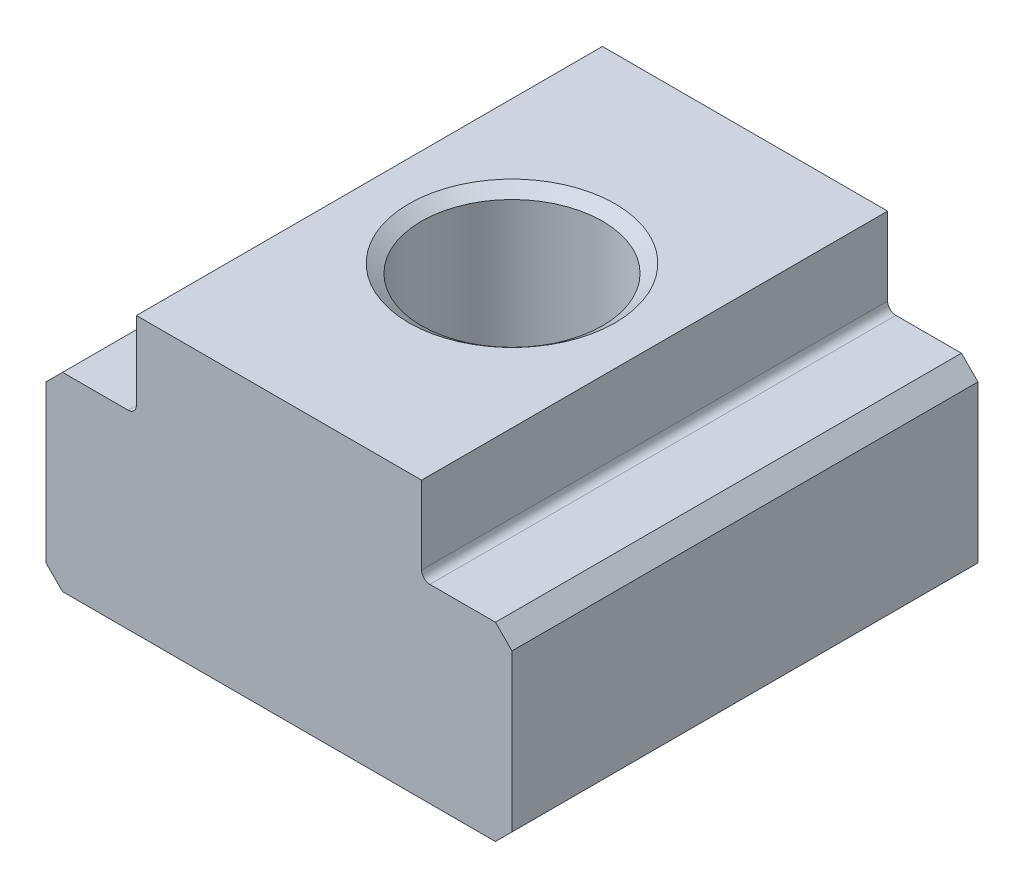
ISO-10303-21;
HEADER;
FILE_DESCRIPTION(('STEP AP214'),'2;1');
FILE_NAME('part.step','',(''),(''),'','','');
FILE_SCHEMA(('AUTOMOTIVE_DESIGN { 1 0 10303 214 1 1 1 1 }'));
ENDSEC;
DATA;
#1=APPLICATION_CONTEXT('core data for automotive mechanical design processes');
#2=APPLICATION_PROTOCOL_DEFINITION('international standard','automotive_design',2000,#1);
#3=PRODUCT_CONTEXT('',#1,'mechanical');
#4=PRODUCT('Part','Part','',(#3));
#5=PRODUCT_RELATED_PRODUCT_CATEGORY('part','',(#4));
#6=PRODUCT_DEFINITION_FORMATION('','',#4);
#7=PRODUCT_DEFINITION_CONTEXT('part definition',#1,'design');
#8=PRODUCT_DEFINITION('design','',#6,#7);
#9=PRODUCT_DEFINITION_SHAPE('','',#8);
#10=(LENGTH_UNIT() NAMED_UNIT(*) SI_UNIT(.MILLI.,.METRE.));
#11=(NAMED_UNIT(*) PLANE_ANGLE_UNIT() SI_UNIT($,.RADIAN.));
#12=(NAMED_UNIT(*) SI_UNIT($,.STERADIAN.) SOLID_ANGLE_UNIT());
#13=UNCERTAINTY_MEASURE_WITH_UNIT(LENGTH_MEASURE(1.E-05),#10,'distance_accuracy_value','');
#14=(GEOMETRIC_REPRESENTATION_CONTEXT(3) GLOBAL_UNCERTAINTY_ASSIGNED_CONTEXT((#13)) GLOBAL_UNIT_ASSIGNED_CONTEXT((#10,
#11,#12)) REPRESENTATION_CONTEXT('',''));
#15=CARTESIAN_POINT('',(0.,0.,0.));
#16=DIRECTION('',(0.,0.,1.));
#17=DIRECTION('',(1.,0.,0.));
#18=AXIS2_PLACEMENT_3D('',#15,#16,#17);
#19=CARTESIAN_POINT('',(0.,0.,-21.4376));
#20=DIRECTION('',(0.,1.,0.));
#21=DIRECTION('',(-1.,0.,0.));
#22=AXIS2_PLACEMENT_3D('',#19,#20,#21);
#23=CYLINDRICAL_SURFACE('',#22,8.33374);
#24=CARTESIAN_POINT('',(0.,0.859529231967694,-21.4376));
#25=DIRECTION('',(0.,-1.,0.));
#26=DIRECTION('',(0.,0.,-1.));
#27=AXIS2_PLACEMENT_3D('',#24,#25,#26);
#28=CIRCLE('',#27,8.33374);
#29=CARTESIAN_POINT('',(0.,0.859529231967695,-29.77134));
#30=VERTEX_POINT('',#29);
#31=EDGE_CURVE('E245',#30,#30,#28,.F.);
#32=ORIENTED_EDGE('',*,*,#31,.F.);
#33=EDGE_LOOP('',(#32));
#34=FACE_BOUND('',#33,.T.);
#35=CARTESIAN_POINT('',(0.,24.5912707680323,-21.4376));
#36=DIRECTION('',(0.,1.,0.));
#37=DIRECTION('',(0.,0.,1.));
#38=AXIS2_PLACEMENT_3D('',#35,#36,#37);
#39=CIRCLE('',#38,8.33374);
#40=CARTESIAN_POINT('',(0.,24.5912707680323,-13.10386));
#41=VERTEX_POINT('',#40);
#42=EDGE_CURVE('E262',#41,#41,#39,.F.);
#43=ORIENTED_EDGE('',*,*,#42,.F.);
#44=EDGE_LOOP('',(#43));
#45=FACE_BOUND('',#44,.T.);
#46=ADVANCED_FACE('F32',(#34,#45),#23,.F.);
#47=CARTESIAN_POINT('',(-21.4376,0.,-42.8752));
#48=DIRECTION('',(-1.,0.,0.));
#49=DIRECTION('',(0.,-1.,0.));
#50=AXIS2_PLACEMENT_3D('',#47,#48,#49);
#51=PLANE('',#50);
#52=DIRECTION('',(0.,-1.,0.));
#53=VECTOR('',#52,1.);
#54=CARTESIAN_POINT('',(-21.4376,0.,-42.8752));
#55=LINE('',#54,#53);
#56=CARTESIAN_POINT('',(-21.4376,15.9512,-42.8752));
#57=VERTEX_POINT('',#56);
#58=CARTESIAN_POINT('',(-21.4376,1.52400000000001,-42.8752));
#59=VERTEX_POINT('',#58);
#60=EDGE_CURVE('E206',#57,#59,#55,.T.);
#61=ORIENTED_EDGE('',*,*,#60,.T.);
#62=DIRECTION('',(0.,0.,1.));
#63=VECTOR('',#62,1.);
#64=CARTESIAN_POINT('',(-21.4376,1.52400000000001,-42.8752));
#65=LINE('',#64,#63);
#66=CARTESIAN_POINT('',(-21.4376,1.52400000000001,0.));
#67=VERTEX_POINT('',#66);
#68=EDGE_CURVE('E41',#59,#67,#65,.T.);
#69=ORIENTED_EDGE('',*,*,#68,.T.);
#70=DIRECTION('',(0.,-1.,0.));
#71=VECTOR('',#70,1.);
#72=CARTESIAN_POINT('',(-21.4376,0.,0.));
#73=LINE('',#72,#71);
#74=CARTESIAN_POINT('',(-21.4376,15.9512,0.));
#75=VERTEX_POINT('',#74);
#76=EDGE_CURVE('E178',#75,#67,#73,.T.);
#77=ORIENTED_EDGE('',*,*,#76,.F.);
#78=DIRECTION('',(0.,0.,-1.));
#79=VECTOR('',#78,1.);
#80=CARTESIAN_POINT('',(-21.4376,15.9512,-42.8752));
#81=LINE('',#80,#79);
#82=EDGE_CURVE('E241',#75,#57,#81,.T.);
#83=ORIENTED_EDGE('',*,*,#82,.T.);
#84=EDGE_LOOP('',(#61,#69,#77,#83));
#85=FACE_BOUND('',#84,.T.);
#86=ADVANCED_FACE('F289',(#85),#51,.T.);
#87=CARTESIAN_POINT('',(-21.4376,17.4752,-42.8752));
#88=DIRECTION('',(0.,1.,0.));
#89=DIRECTION('',(0.,0.,1.));
#90=AXIS2_PLACEMENT_3D('',#87,#88,#89);
#91=PLANE('',#90);
#92=DIRECTION('',(-1.,0.,0.));
#93=VECTOR('',#92,1.);
#94=CARTESIAN_POINT('',(-21.4376,17.4752,-42.8752));
#95=LINE('',#94,#93);
#96=CARTESIAN_POINT('',(-13.8811,17.4752,-42.8752));
#97=VERTEX_POINT('',#96);
#98=CARTESIAN_POINT('',(-19.9136,17.4752,-42.8752));
#99=VERTEX_POINT('',#98);
#100=EDGE_CURVE('E156',#97,#99,#95,.T.);
#101=ORIENTED_EDGE('',*,*,#100,.T.);
#102=DIRECTION('',(0.,0.,1.));
#103=VECTOR('',#102,1.);
#104=CARTESIAN_POINT('',(-19.9136,17.4752,-42.8752));
#105=LINE('',#104,#103);
#106=CARTESIAN_POINT('',(-19.9136,17.4752,0.));
#107=VERTEX_POINT('',#106);
#108=EDGE_CURVE('E11',#99,#107,#105,.T.);
#109=ORIENTED_EDGE('',*,*,#108,.T.);
#110=DIRECTION('',(-1.,0.,0.));
#111=VECTOR('',#110,1.);
#112=CARTESIAN_POINT('',(-21.4376,17.4752,0.));
#113=LINE('',#112,#111);
#114=CARTESIAN_POINT('',(-13.8811,17.4752,0.));
#115=VERTEX_POINT('',#114);
#116=EDGE_CURVE('E203',#115,#107,#113,.T.);
#117=ORIENTED_EDGE('',*,*,#116,.F.);
#118=DIRECTION('',(0.,0.,1.));
#119=VECTOR('',#118,1.);
#120=CARTESIAN_POINT('',(-13.8811,17.4752,-42.8752));
#121=LINE('',#120,#119);
#122=EDGE_CURVE('E207',#97,#115,#121,.T.);
#123=ORIENTED_EDGE('',*,*,#122,.F.);
#124=EDGE_LOOP('',(#101,#109,#117,#123));
#125=FACE_BOUND('',#124,.T.);
#126=ADVANCED_FACE('F298',(#125),#91,.T.);
#127=CARTESIAN_POINT('',(-13.8811,18.2372,-42.8752));
#128=DIRECTION('',(0.,0.,1.));
#129=DIRECTION('',(1.,0.,0.));
#130=AXIS2_PLACEMENT_3D('',#127,#128,#129);
#131=CYLINDRICAL_SURFACE('',#130,0.762000000000001);
#132=CARTESIAN_POINT('',(-13.8811,18.2372,0.));
#133=DIRECTION('',(0.,0.,-1.));
#134=DIRECTION('',(-1.,0.,0.));
#135=AXIS2_PLACEMENT_3D('',#132,#133,#134);
#136=CIRCLE('',#135,0.762000000000001);
#137=CARTESIAN_POINT('',(-13.1191,18.2372,0.));
#138=VERTEX_POINT('',#137);
#139=EDGE_CURVE('E200',#138,#115,#136,.T.);
#140=ORIENTED_EDGE('',*,*,#139,.F.);
#141=DIRECTION('',(0.,0.,1.));
#142=VECTOR('',#141,1.);
#143=CARTESIAN_POINT('',(-13.1191,18.2372,-42.8752));
#144=LINE('',#143,#142);
#145=CARTESIAN_POINT('',(-13.1191,18.2372,-42.8752));
#146=VERTEX_POINT('',#145);
#147=EDGE_CURVE('E210',#146,#138,#144,.T.);
#148=ORIENTED_EDGE('',*,*,#147,.F.);
#149=CARTESIAN_POINT('',(-13.8811,18.2372,-42.8752));
#150=DIRECTION('',(0.,0.,-1.));
#151=DIRECTION('',(-1.,0.,0.));
#152=AXIS2_PLACEMENT_3D('',#149,#150,#151);
#153=CIRCLE('',#152,0.762000000000001);
#154=EDGE_CURVE('E173',#146,#97,#153,.T.);
#155=ORIENTED_EDGE('',*,*,#154,.T.);
#156=ORIENTED_EDGE('',*,*,#122,.T.);
#157=EDGE_LOOP('',(#140,#148,#155,#156));
#158=FACE_BOUND('',#157,.T.);
#159=ADVANCED_FACE('F302',(#158),#131,.F.);
#160=CARTESIAN_POINT('',(-13.1191,18.2372,-42.8752));
#161=DIRECTION('',(-1.,0.,0.));
#162=DIRECTION('',(0.,-1.,0.));
#163=AXIS2_PLACEMENT_3D('',#160,#161,#162);
#164=PLANE('',#163);
#165=DIRECTION('',(0.,-1.,0.));
#166=VECTOR('',#165,1.);
#167=CARTESIAN_POINT('',(-13.1191,18.2372,0.));
#168=LINE('',#167,#166);
#169=CARTESIAN_POINT('',(-13.1191,25.4,0.));
#170=VERTEX_POINT('',#169);
#171=EDGE_CURVE('E197',#170,#138,#168,.T.);
#172=ORIENTED_EDGE('',*,*,#171,.F.);
#173=DIRECTION('',(0.,0.,1.));
#174=VECTOR('',#173,1.);
#175=CARTESIAN_POINT('',(-13.1191,25.4,-42.8752));
#176=LINE('',#175,#174);
#177=CARTESIAN_POINT('',(-13.1191,25.4,-42.8752));
#178=VERTEX_POINT('',#177);
#179=EDGE_CURVE('E212',#178,#170,#176,.T.);
#180=ORIENTED_EDGE('',*,*,#179,.F.);
#181=DIRECTION('',(0.,-1.,0.));
#182=VECTOR('',#181,1.);
#183=CARTESIAN_POINT('',(-13.1191,18.2372,-42.8752));
#184=LINE('',#183,#182);
#185=EDGE_CURVE('E170',#178,#146,#184,.T.);
#186=ORIENTED_EDGE('',*,*,#185,.T.);
#187=ORIENTED_EDGE('',*,*,#147,.T.);
#188=EDGE_LOOP('',(#172,#180,#186,#187));
#189=FACE_BOUND('',#188,.T.);
#190=ADVANCED_FACE('F306',(#189),#164,.T.);
#191=CARTESIAN_POINT('',(-13.1191,25.4,-42.8752));
#192=DIRECTION('',(0.,1.,0.));
#193=DIRECTION('',(-1.,0.,0.));
#194=AXIS2_PLACEMENT_3D('',#191,#192,#193);
#195=PLANE('',#194);
#196=CARTESIAN_POINT('',(0.,25.4,-21.4376));
#197=DIRECTION('',(0.,1.,0.));
#198=DIRECTION('',(-1.,0.,0.));
#199=AXIS2_PLACEMENT_3D('',#196,#197,#198);
#200=CIRCLE('',#199,9.48872504062877);
#201=CARTESIAN_POINT('',(-9.48872504062877,25.4,-21.4376));
#202=VERTEX_POINT('',#201);
#203=EDGE_CURVE('E36',#202,#202,#200,.F.);
#204=ORIENTED_EDGE('',*,*,#203,.T.);
#205=EDGE_LOOP('',(#204));
#206=FACE_BOUND('',#205,.T.);
#207=DIRECTION('',(-1.,0.,0.));
#208=VECTOR('',#207,1.);
#209=CARTESIAN_POINT('',(-13.1191,25.4,0.));
#210=LINE('',#209,#208);
#211=CARTESIAN_POINT('',(13.1191,25.4,0.));
#212=VERTEX_POINT('',#211);
#213=EDGE_CURVE('E194',#212,#170,#210,.T.);
#214=ORIENTED_EDGE('',*,*,#213,.F.);
#215=DIRECTION('',(0.,0.,1.));
#216=VECTOR('',#215,1.);
#217=CARTESIAN_POINT('',(13.1191,25.4,-42.8752));
#218=LINE('',#217,#216);
#219=CARTESIAN_POINT('',(13.1191,25.4,-42.8752));
#220=VERTEX_POINT('',#219);
#221=EDGE_CURVE('E214',#220,#212,#218,.T.);
#222=ORIENTED_EDGE('',*,*,#221,.F.);
#223=DIRECTION('',(-1.,0.,0.));
#224=VECTOR('',#223,1.);
#225=CARTESIAN_POINT('',(-13.1191,25.4,-42.8752));
#226=LINE('',#225,#224);
#227=EDGE_CURVE('E164',#220,#178,#226,.T.);
#228=ORIENTED_EDGE('',*,*,#227,.T.);
#229=ORIENTED_EDGE('',*,*,#179,.T.);
#230=EDGE_LOOP('',(#214,#222,#228,#229));
#231=FACE_BOUND('',#230,.T.);
#232=ADVANCED_FACE('F309',(#206,#231),#195,.T.);
#233=CARTESIAN_POINT('',(13.1191,18.2372,-42.8752));
#234=DIRECTION('',(1.,0.,0.));
#235=DIRECTION('',(0.,1.,0.));
#236=AXIS2_PLACEMENT_3D('',#233,#234,#235);
#237=PLANE('',#236);
#238=DIRECTION('',(0.,1.,0.));
#239=VECTOR('',#238,1.);
#240=CARTESIAN_POINT('',(13.1191,18.2372,0.));
#241=LINE('',#240,#239);
#242=CARTESIAN_POINT('',(13.1191,18.2372,0.));
#243=VERTEX_POINT('',#242);
#244=EDGE_CURVE('E191',#243,#212,#241,.T.);
#245=ORIENTED_EDGE('',*,*,#244,.F.);
#246=DIRECTION('',(0.,0.,1.));
#247=VECTOR('',#246,1.);
#248=CARTESIAN_POINT('',(13.1191,18.2372,-42.8752));
#249=LINE('',#248,#247);
#250=CARTESIAN_POINT('',(13.1191,18.2372,-42.8752));
#251=VERTEX_POINT('',#250);
#252=EDGE_CURVE('E155',#251,#243,#249,.T.);
#253=ORIENTED_EDGE('',*,*,#252,.F.);
#254=DIRECTION('',(0.,1.,0.));
#255=VECTOR('',#254,1.);
#256=CARTESIAN_POINT('',(13.1191,18.2372,-42.8752));
#257=LINE('',#256,#255);
#258=EDGE_CURVE('E162',#251,#220,#257,.T.);
#259=ORIENTED_EDGE('',*,*,#258,.T.);
#260=ORIENTED_EDGE('',*,*,#221,.T.);
#261=EDGE_LOOP('',(#245,#253,#259,#260));
#262=FACE_BOUND('',#261,.T.);
#263=ADVANCED_FACE('F312',(#262),#237,.T.);
#264=CARTESIAN_POINT('',(13.8811,18.2372,-42.8752));
#265=DIRECTION('',(0.,0.,1.));
#266=DIRECTION('',(1.,0.,0.));
#267=AXIS2_PLACEMENT_3D('',#264,#265,#266);
#268=CYLINDRICAL_SURFACE('',#267,0.762000000000001);
#269=CARTESIAN_POINT('',(13.8811,18.2372,0.));
#270=DIRECTION('',(0.,0.,-1.));
#271=DIRECTION('',(1.,0.,0.));
#272=AXIS2_PLACEMENT_3D('',#269,#270,#271);
#273=CIRCLE('',#272,0.762000000000001);
#274=CARTESIAN_POINT('',(13.8811,17.4752,0.));
#275=VERTEX_POINT('',#274);
#276=EDGE_CURVE('E154',#275,#243,#273,.T.);
#277=ORIENTED_EDGE('',*,*,#276,.F.);
#278=DIRECTION('',(0.,0.,1.));
#279=VECTOR('',#278,1.);
#280=CARTESIAN_POINT('',(13.8811,17.4752,-42.8752));
#281=LINE('',#280,#279);
#282=CARTESIAN_POINT('',(13.8811,17.4752,-42.8752));
#283=VERTEX_POINT('',#282);
#284=EDGE_CURVE('E141',#283,#275,#281,.T.);
#285=ORIENTED_EDGE('',*,*,#284,.F.);
#286=CARTESIAN_POINT('',(13.8811,18.2372,-42.8752));
#287=DIRECTION('',(0.,0.,-1.));
#288=DIRECTION('',(1.,0.,0.));
#289=AXIS2_PLACEMENT_3D('',#286,#287,#288);
#290=CIRCLE('',#289,0.762000000000001);
#291=EDGE_CURVE('E147',#283,#251,#290,.T.);
#292=ORIENTED_EDGE('',*,*,#291,.T.);
#293=ORIENTED_EDGE('',*,*,#252,.T.);
#294=EDGE_LOOP('',(#277,#285,#292,#293));
#295=FACE_BOUND('',#294,.T.);
#296=ADVANCED_FACE('F152',(#295),#268,.F.);
#297=CARTESIAN_POINT('',(13.8811,17.4752,-42.8752));
#298=DIRECTION('',(0.,1.,0.));
#299=DIRECTION('',(-1.,0.,0.));
#300=AXIS2_PLACEMENT_3D('',#297,#298,#299);
#301=PLANE('',#300);
#302=DIRECTION('',(-1.,0.,0.));
#303=VECTOR('',#302,1.);
#304=CARTESIAN_POINT('',(13.8811,17.4752,0.));
#305=LINE('',#304,#303);
#306=CARTESIAN_POINT('',(19.9136,17.4752,0.));
#307=VERTEX_POINT('',#306);
#308=EDGE_CURVE('E188',#307,#275,#305,.T.);
#309=ORIENTED_EDGE('',*,*,#308,.F.);
#310=DIRECTION('',(0.,0.,-1.));
#311=VECTOR('',#310,1.);
#312=CARTESIAN_POINT('',(19.9136,17.4752,-42.8752));
#313=LINE('',#312,#311);
#314=CARTESIAN_POINT('',(19.9136,17.4752,-42.8752));
#315=VERTEX_POINT('',#314);
#316=EDGE_CURVE('E144',#307,#315,#313,.T.);
#317=ORIENTED_EDGE('',*,*,#316,.T.);
#318=DIRECTION('',(-1.,0.,0.));
#319=VECTOR('',#318,1.);
#320=CARTESIAN_POINT('',(13.8811,17.4752,-42.8752));
#321=LINE('',#320,#319);
#322=EDGE_CURVE('E137',#315,#283,#321,.T.);
#323=ORIENTED_EDGE('',*,*,#322,.T.);
#324=ORIENTED_EDGE('',*,*,#284,.T.);
#325=EDGE_LOOP('',(#309,#317,#323,#324));
#326=FACE_BOUND('',#325,.T.);
#327=ADVANCED_FACE('F140',(#326),#301,.T.);
#328=CARTESIAN_POINT('',(21.4376,0.,-42.8752));
#329=DIRECTION('',(1.,0.,0.));
#330=DIRECTION('',(0.,1.,0.));
#331=AXIS2_PLACEMENT_3D('',#328,#329,#330);
#332=PLANE('',#331);
#333=DIRECTION('',(0.,1.,0.));
#334=VECTOR('',#333,1.);
#335=CARTESIAN_POINT('',(21.4376,0.,-42.8752));
#336=LINE('',#335,#334);
#337=CARTESIAN_POINT('',(21.4376,1.52400000000002,-42.8752));
#338=VERTEX_POINT('',#337);
#339=CARTESIAN_POINT('',(21.4376,15.9512,-42.8752));
#340=VERTEX_POINT('',#339);
#341=EDGE_CURVE('E148',#338,#340,#336,.T.);
#342=ORIENTED_EDGE('',*,*,#341,.T.);
#343=DIRECTION('',(0.,0.,1.));
#344=VECTOR('',#343,1.);
#345=CARTESIAN_POINT('',(21.4376,15.9512,-42.8752));
#346=LINE('',#345,#344);
#347=CARTESIAN_POINT('',(21.4376,15.9512,0.));
#348=VERTEX_POINT('',#347);
#349=EDGE_CURVE('E218',#340,#348,#346,.T.);
#350=ORIENTED_EDGE('',*,*,#349,.T.);
#351=DIRECTION('',(0.,1.,0.));
#352=VECTOR('',#351,1.);
#353=CARTESIAN_POINT('',(21.4376,0.,0.));
#354=LINE('',#353,#352);
#355=CARTESIAN_POINT('',(21.4376,1.52400000000002,0.));
#356=VERTEX_POINT('',#355);
#357=EDGE_CURVE('E185',#356,#348,#354,.T.);
#358=ORIENTED_EDGE('',*,*,#357,.F.);
#359=DIRECTION('',(0.,0.,-1.));
#360=VECTOR('',#359,1.);
#361=CARTESIAN_POINT('',(21.4376,1.52400000000002,-42.8752));
#362=LINE('',#361,#360);
#363=EDGE_CURVE('E209',#356,#338,#362,.T.);
#364=ORIENTED_EDGE('',*,*,#363,.T.);
#365=EDGE_LOOP('',(#342,#350,#358,#364));
#366=FACE_BOUND('',#365,.T.);
#367=ADVANCED_FACE('F273',(#366),#332,.T.);
#368=CARTESIAN_POINT('',(-21.4376,0.,-42.8752));
#369=DIRECTION('',(0.,-1.,0.));
#370=DIRECTION('',(1.,0.,0.));
#371=AXIS2_PLACEMENT_3D('',#368,#369,#370);
#372=PLANE('',#371);
#373=CARTESIAN_POINT('',(0.,0.,-21.4376));
#374=DIRECTION('',(0.,-1.,0.));
#375=DIRECTION('',(1.,0.,0.));
#376=AXIS2_PLACEMENT_3D('',#373,#374,#375);
#377=CIRCLE('',#376,9.52500000000001);
#378=CARTESIAN_POINT('',(9.52500000000001,0.,-21.4376));
#379=VERTEX_POINT('',#378);
#380=EDGE_CURVE('E182',#379,#379,#377,.F.);
#381=ORIENTED_EDGE('',*,*,#380,.T.);
#382=EDGE_LOOP('',(#381));
#383=FACE_BOUND('',#382,.T.);
#384=DIRECTION('',(1.,0.,0.));
#385=VECTOR('',#384,1.);
#386=CARTESIAN_POINT('',(-21.4376,0.,-42.8752));
#387=LINE('',#386,#385);
#388=CARTESIAN_POINT('',(-19.9136,0.,-42.8752));
#389=VERTEX_POINT('',#388);
#390=CARTESIAN_POINT('',(19.9136,0.,-42.8752));
#391=VERTEX_POINT('',#390);
#392=EDGE_CURVE('E269',#389,#391,#387,.T.);
#393=ORIENTED_EDGE('',*,*,#392,.T.);
#394=DIRECTION('',(0.,0.,1.));
#395=VECTOR('',#394,1.);
#396=CARTESIAN_POINT('',(19.9136,0.,-42.8752));
#397=LINE('',#396,#395);
#398=CARTESIAN_POINT('',(19.9136,0.,0.));
#399=VERTEX_POINT('',#398);
#400=EDGE_CURVE('E238',#391,#399,#397,.T.);
#401=ORIENTED_EDGE('',*,*,#400,.T.);
#402=DIRECTION('',(1.,0.,0.));
#403=VECTOR('',#402,1.);
#404=CARTESIAN_POINT('',(-21.4376,0.,0.));
#405=LINE('',#404,#403);
#406=CARTESIAN_POINT('',(-19.9136,0.,0.));
#407=VERTEX_POINT('',#406);
#408=EDGE_CURVE('E181',#407,#399,#405,.T.);
#409=ORIENTED_EDGE('',*,*,#408,.F.);
#410=DIRECTION('',(0.,0.,-1.));
#411=VECTOR('',#410,1.);
#412=CARTESIAN_POINT('',(-19.9136,0.,-42.8752));
#413=LINE('',#412,#411);
#414=EDGE_CURVE('E56',#407,#389,#413,.T.);
#415=ORIENTED_EDGE('',*,*,#414,.T.);
#416=EDGE_LOOP('',(#393,#401,#409,#415));
#417=FACE_BOUND('',#416,.T.);
#418=ADVANCED_FACE('F251',(#383,#417),#372,.T.);
#419=CARTESIAN_POINT('',(-13.8811,18.2372,-42.8752));
#420=DIRECTION('',(0.,0.,-1.));
#421=DIRECTION('',(-1.,0.,0.));
#422=AXIS2_PLACEMENT_3D('',#419,#420,#421);
#423=PLANE('',#422);
#424=ORIENTED_EDGE('',*,*,#322,.F.);
#425=DIRECTION('',(-0.707106781186544,0.707106781186551,0.));
#426=VECTOR('',#425,1.);
#427=CARTESIAN_POINT('',(2.63525000000015,34.75355,-42.8752));
#428=LINE('',#427,#426);
#429=EDGE_CURVE('E235',#315,#340,#428,.F.);
#430=ORIENTED_EDGE('',*,*,#429,.T.);
#431=ORIENTED_EDGE('',*,*,#341,.F.);
#432=DIRECTION('',(0.70710678118655,0.707106781186545,0.));
#433=VECTOR('',#432,1.);
#434=CARTESIAN_POINT('',(12.1348499999999,-7.77875000000005,-42.8752));
#435=LINE('',#434,#433);
#436=EDGE_CURVE('E49',#338,#391,#435,.F.);
#437=ORIENTED_EDGE('',*,*,#436,.T.);
#438=ORIENTED_EDGE('',*,*,#392,.F.);
#439=DIRECTION('',(0.707106781186551,-0.707106781186544,0.));
#440=VECTOR('',#439,1.);
#441=CARTESIAN_POINT('',(-26.01595,6.10234999999993,-42.8752));
#442=LINE('',#441,#440);
#443=EDGE_CURVE('E232',#389,#59,#442,.F.);
#444=ORIENTED_EDGE('',*,*,#443,.T.);
#445=ORIENTED_EDGE('',*,*,#60,.F.);
#446=DIRECTION('',(-0.707106781186551,-0.707106781186544,0.));
#447=VECTOR('',#446,1.);
#448=CARTESIAN_POINT('',(-16.51635,20.87245,-42.8752));
#449=LINE('',#448,#447);
#450=EDGE_CURVE('E230',#57,#99,#449,.F.);
#451=ORIENTED_EDGE('',*,*,#450,.T.);
#452=ORIENTED_EDGE('',*,*,#100,.F.);
#453=ORIENTED_EDGE('',*,*,#154,.F.);
#454=ORIENTED_EDGE('',*,*,#185,.F.);
#455=ORIENTED_EDGE('',*,*,#227,.F.);
#456=ORIENTED_EDGE('',*,*,#258,.F.);
#457=ORIENTED_EDGE('',*,*,#291,.F.);
#458=EDGE_LOOP('',(#424,#430,#431,#437,#438,#444,#445,#451,#452,#453,#454,#455,#456,#457));
#459=FACE_BOUND('',#458,.T.);
#460=ADVANCED_FACE('F159',(#459),#423,.T.);
#461=CARTESIAN_POINT('',(-13.8811,18.2372,0.));
#462=DIRECTION('',(0.,0.,-1.));
#463=DIRECTION('',(-1.,0.,0.));
#464=AXIS2_PLACEMENT_3D('',#461,#462,#463);
#465=PLANE('',#464);
#466=ORIENTED_EDGE('',*,*,#357,.T.);
#467=DIRECTION('',(0.707106781186544,-0.707106781186551,0.));
#468=VECTOR('',#467,1.);
#469=CARTESIAN_POINT('',(21.4376,15.9512,0.));
#470=LINE('',#469,#468);
#471=EDGE_CURVE('E227',#348,#307,#470,.F.);
#472=ORIENTED_EDGE('',*,*,#471,.T.);
#473=ORIENTED_EDGE('',*,*,#308,.T.);
#474=ORIENTED_EDGE('',*,*,#276,.T.);
#475=ORIENTED_EDGE('',*,*,#244,.T.);
#476=ORIENTED_EDGE('',*,*,#213,.T.);
#477=ORIENTED_EDGE('',*,*,#171,.T.);
#478=ORIENTED_EDGE('',*,*,#139,.T.);
#479=ORIENTED_EDGE('',*,*,#116,.T.);
#480=DIRECTION('',(0.707106781186551,0.707106781186544,0.));
#481=VECTOR('',#480,1.);
#482=CARTESIAN_POINT('',(-19.9136,17.4752,0.));
#483=LINE('',#482,#481);
#484=EDGE_CURVE('E221',#107,#75,#483,.F.);
#485=ORIENTED_EDGE('',*,*,#484,.T.);
#486=ORIENTED_EDGE('',*,*,#76,.T.);
#487=DIRECTION('',(-0.707106781186551,0.707106781186544,0.));
#488=VECTOR('',#487,1.);
#489=CARTESIAN_POINT('',(-21.4376,1.52400000000001,0.));
#490=LINE('',#489,#488);
#491=EDGE_CURVE('E223',#67,#407,#490,.F.);
#492=ORIENTED_EDGE('',*,*,#491,.T.);
#493=ORIENTED_EDGE('',*,*,#408,.T.);
#494=DIRECTION('',(-0.70710678118655,-0.707106781186545,0.));
#495=VECTOR('',#494,1.);
#496=CARTESIAN_POINT('',(19.9136,0.,0.));
#497=LINE('',#496,#495);
#498=EDGE_CURVE('E225',#399,#356,#497,.F.);
#499=ORIENTED_EDGE('',*,*,#498,.T.);
#500=EDGE_LOOP('',(#466,#472,#473,#474,#475,#476,#477,#478,#479,#485,#486,#492,#493,#499));
#501=FACE_BOUND('',#500,.T.);
#502=ADVANCED_FACE('F279',(#501),#465,.F.);
#503=CARTESIAN_POINT('',(21.4376,15.9512,-42.8752));
#504=DIRECTION('',(-0.707106781186551,-0.707106781186544,0.));
#505=DIRECTION('',(0.707106781186544,-0.707106781186551,0.));
#506=AXIS2_PLACEMENT_3D('',#503,#504,#505);
#507=PLANE('',#506);
#508=ORIENTED_EDGE('',*,*,#429,.F.);
#509=ORIENTED_EDGE('',*,*,#316,.F.);
#510=ORIENTED_EDGE('',*,*,#471,.F.);
#511=ORIENTED_EDGE('',*,*,#349,.F.);
#512=EDGE_LOOP('',(#508,#509,#510,#511));
#513=FACE_BOUND('',#512,.T.);
#514=ADVANCED_FACE('F277',(#513),#507,.F.);
#515=CARTESIAN_POINT('',(19.9136,0.,-42.8752));
#516=DIRECTION('',(-0.707106781186545,0.70710678118655,0.));
#517=DIRECTION('',(-0.70710678118655,-0.707106781186545,0.));
#518=AXIS2_PLACEMENT_3D('',#515,#516,#517);
#519=PLANE('',#518);
#520=ORIENTED_EDGE('',*,*,#436,.F.);
#521=ORIENTED_EDGE('',*,*,#363,.F.);
#522=ORIENTED_EDGE('',*,*,#498,.F.);
#523=ORIENTED_EDGE('',*,*,#400,.F.);
#524=EDGE_LOOP('',(#520,#521,#522,#523));
#525=FACE_BOUND('',#524,.T.);
#526=ADVANCED_FACE('F281',(#525),#519,.F.);
#527=CARTESIAN_POINT('',(-21.4376,1.52400000000001,-42.8752));
#528=DIRECTION('',(0.707106781186544,0.707106781186551,0.));
#529=DIRECTION('',(-0.707106781186551,0.707106781186544,0.));
#530=AXIS2_PLACEMENT_3D('',#527,#528,#529);
#531=PLANE('',#530);
#532=ORIENTED_EDGE('',*,*,#443,.F.);
#533=ORIENTED_EDGE('',*,*,#414,.F.);
#534=ORIENTED_EDGE('',*,*,#491,.F.);
#535=ORIENTED_EDGE('',*,*,#68,.F.);
#536=EDGE_LOOP('',(#532,#533,#534,#535));
#537=FACE_BOUND('',#536,.T.);
#538=ADVANCED_FACE('F287',(#537),#531,.F.);
#539=CARTESIAN_POINT('',(-19.9136,17.4752,-42.8752));
#540=DIRECTION('',(0.707106781186544,-0.707106781186551,0.));
#541=DIRECTION('',(0.707106781186551,0.707106781186544,0.));
#542=AXIS2_PLACEMENT_3D('',#539,#540,#541);
#543=PLANE('',#542);
#544=ORIENTED_EDGE('',*,*,#450,.F.);
#545=ORIENTED_EDGE('',*,*,#82,.F.);
#546=ORIENTED_EDGE('',*,*,#484,.F.);
#547=ORIENTED_EDGE('',*,*,#108,.F.);
#548=EDGE_LOOP('',(#544,#545,#546,#547));
#549=FACE_BOUND('',#548,.T.);
#550=ADVANCED_FACE('F34',(#549),#543,.F.);
#551=CARTESIAN_POINT('',(0.,0.0254000000000018,-21.4376));
#552=DIRECTION('',(0.,-1.,0.));
#553=DIRECTION('',(0.,0.,-1.));
#554=AXIS2_PLACEMENT_3D('',#551,#552,#553);
#555=CONICAL_SURFACE('',#554,9.52500000000001,0.959931088596887);
#556=CARTESIAN_POINT('',(0.,0.0254000000000018,-21.4376));
#557=DIRECTION('',(0.,1.,0.));
#558=DIRECTION('',(0.,0.,1.));
#559=AXIS2_PLACEMENT_3D('',#556,#557,#558);
#560=CIRCLE('',#559,9.52500000000001);
#561=CARTESIAN_POINT('',(0.,0.0254000000000011,-11.9126));
#562=VERTEX_POINT('',#561);
#563=EDGE_CURVE('E247',#562,#562,#560,.T.);
#564=ORIENTED_EDGE('',*,*,#563,.F.);
#565=EDGE_LOOP('',(#564));
#566=FACE_BOUND('',#565,.T.);
#567=ORIENTED_EDGE('',*,*,#31,.T.);
#568=EDGE_LOOP('',(#567));
#569=FACE_BOUND('',#568,.T.);
#570=ADVANCED_FACE('F257',(#566,#569),#555,.F.);
#571=CARTESIAN_POINT('',(0.,44.45,-21.4376));
#572=DIRECTION('',(0.,1.,0.));
#573=DIRECTION('',(0.,0.,1.));
#574=AXIS2_PLACEMENT_3D('',#571,#572,#573);
#575=CYLINDRICAL_SURFACE('',#574,9.52500000000001);
#576=ORIENTED_EDGE('',*,*,#380,.F.);
#577=EDGE_LOOP('',(#576));
#578=FACE_BOUND('',#577,.T.);
#579=ORIENTED_EDGE('',*,*,#563,.T.);
#580=EDGE_LOOP('',(#579));
#581=FACE_BOUND('',#580,.T.);
#582=ADVANCED_FACE('F253',(#578,#581),#575,.F.);
#583=CARTESIAN_POINT('',(0.,24.5078578448355,-21.4376));
#584=DIRECTION('',(0.,1.,0.));
#585=DIRECTION('',(0.,0.,1.));
#586=AXIS2_PLACEMENT_3D('',#583,#584,#585);
#587=CONICAL_SURFACE('',#586,8.21461400000001,0.959931088596887);
#588=ORIENTED_EDGE('',*,*,#203,.F.);
#589=EDGE_LOOP('',(#588));
#590=FACE_BOUND('',#589,.T.);
#591=ORIENTED_EDGE('',*,*,#42,.T.);
#592=EDGE_LOOP('',(#591));
#593=FACE_BOUND('',#592,.T.);
#594=ADVANCED_FACE('F256',(#590,#593),#587,.F.);
#595=CLOSED_SHELL('',(#46,#86,#126,#159,#190,#232,#263,#296,#327,#367,#418,#460,#502,#514,#526,
#538,#550,#570,#582,#594));
#596=MANIFOLD_SOLID_BREP('B2',#595);
#597=ADVANCED_BREP_SHAPE_REPRESENTATION('',(#18,#596),#14);
#598=SHAPE_DEFINITION_REPRESENTATION(#9,#597);
ENDSEC;
END-ISO-10303-21;
